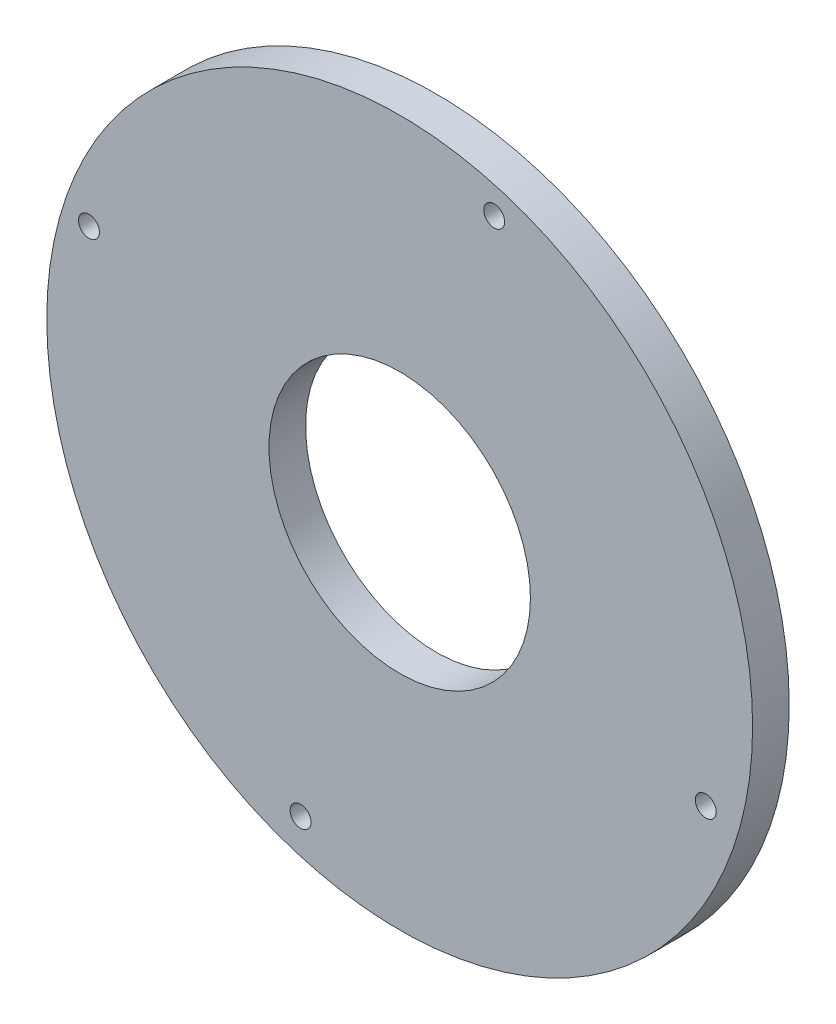
ISO-10303-21;
HEADER;
FILE_DESCRIPTION(('STEP AP214'),'2;1');
FILE_NAME('part.step','',(''),(''),'','','');
FILE_SCHEMA(('AUTOMOTIVE_DESIGN { 1 0 10303 214 1 1 1 1 }'));
ENDSEC;
DATA;
#1=APPLICATION_CONTEXT('core data for automotive mechanical design processes');
#2=APPLICATION_PROTOCOL_DEFINITION('international standard','automotive_design',2000,#1);
#3=PRODUCT_CONTEXT('',#1,'mechanical');
#4=PRODUCT('Part','Part','',(#3));
#5=PRODUCT_RELATED_PRODUCT_CATEGORY('part','',(#4));
#6=PRODUCT_DEFINITION_FORMATION('','',#4);
#7=PRODUCT_DEFINITION_CONTEXT('part definition',#1,'design');
#8=PRODUCT_DEFINITION('design','',#6,#7);
#9=PRODUCT_DEFINITION_SHAPE('','',#8);
#10=(LENGTH_UNIT() NAMED_UNIT(*) SI_UNIT(.MILLI.,.METRE.));
#11=(NAMED_UNIT(*) PLANE_ANGLE_UNIT() SI_UNIT($,.RADIAN.));
#12=(NAMED_UNIT(*) SI_UNIT($,.STERADIAN.) SOLID_ANGLE_UNIT());
#13=UNCERTAINTY_MEASURE_WITH_UNIT(LENGTH_MEASURE(1.E-05),#10,'distance_accuracy_value','');
#14=(GEOMETRIC_REPRESENTATION_CONTEXT(3) GLOBAL_UNCERTAINTY_ASSIGNED_CONTEXT((#13)) GLOBAL_UNIT_ASSIGNED_CONTEXT((#10,
#11,#12)) REPRESENTATION_CONTEXT('',''));
#15=CARTESIAN_POINT('',(0.,0.,0.));
#16=DIRECTION('',(0.,0.,1.));
#17=DIRECTION('',(1.,0.,0.));
#18=AXIS2_PLACEMENT_3D('',#15,#16,#17);
#19=CARTESIAN_POINT('',(0.,0.,7.));
#20=DIRECTION('',(0.,0.,-1.));
#21=DIRECTION('',(-1.,0.,0.));
#22=AXIS2_PLACEMENT_3D('',#19,#20,#21);
#23=CYLINDRICAL_SURFACE('',#22,135.);
#24=CARTESIAN_POINT('',(0.,0.,7.));
#25=DIRECTION('',(0.,0.,1.));
#26=DIRECTION('',(1.,0.,0.));
#27=AXIS2_PLACEMENT_3D('',#24,#25,#26);
#28=CIRCLE('',#27,135.);
#29=CARTESIAN_POINT('',(135.,0.,7.));
#30=VERTEX_POINT('',#29);
#31=EDGE_CURVE('E10',#30,#30,#28,.T.);
#32=ORIENTED_EDGE('',*,*,#31,.F.);
#33=EDGE_LOOP('',(#32));
#34=FACE_BOUND('',#33,.T.);
#35=CARTESIAN_POINT('',(0.,0.,-7.));
#36=DIRECTION('',(0.,0.,1.));
#37=DIRECTION('',(1.,0.,0.));
#38=AXIS2_PLACEMENT_3D('',#35,#36,#37);
#39=CIRCLE('',#38,135.);
#40=CARTESIAN_POINT('',(135.,0.,-7.));
#41=VERTEX_POINT('',#40);
#42=EDGE_CURVE('E36',#41,#41,#39,.T.);
#43=ORIENTED_EDGE('',*,*,#42,.T.);
#44=EDGE_LOOP('',(#43));
#45=FACE_BOUND('',#44,.T.);
#46=ADVANCED_FACE('F33',(#34,#45),#23,.T.);
#47=CARTESIAN_POINT('',(0.,0.,7.));
#48=DIRECTION('',(0.,0.,1.));
#49=DIRECTION('',(1.,0.,0.));
#50=AXIS2_PLACEMENT_3D('',#47,#48,#49);
#51=PLANE('',#50);
#52=CARTESIAN_POINT('',(-37.9203387518934,-116.260536074605,7.));
#53=DIRECTION('',(0.,0.,1.));
#54=DIRECTION('',(1.,0.,0.));
#55=AXIS2_PLACEMENT_3D('',#52,#53,#54);
#56=CIRCLE('',#55,4.00000000000001);
#57=CARTESIAN_POINT('',(-33.9203387518934,-116.260536074605,7.));
#58=VERTEX_POINT('',#57);
#59=EDGE_CURVE('E69',#58,#58,#56,.T.);
#60=ORIENTED_EDGE('',*,*,#59,.F.);
#61=EDGE_LOOP('',(#60));
#62=FACE_BOUND('',#61,.T.);
#63=CARTESIAN_POINT('',(117.072774641553,-35.3331257765481,7.));
#64=DIRECTION('',(0.,0.,1.));
#65=DIRECTION('',(1.,0.,0.));
#66=AXIS2_PLACEMENT_3D('',#63,#64,#65);
#67=CIRCLE('',#66,4.00000000000001);
#68=CARTESIAN_POINT('',(121.072774641553,-35.3331257765481,7.));
#69=VERTEX_POINT('',#68);
#70=EDGE_CURVE('E63',#69,#69,#67,.T.);
#71=ORIENTED_EDGE('',*,*,#70,.F.);
#72=EDGE_LOOP('',(#71));
#73=FACE_BOUND('',#72,.T.);
#74=CARTESIAN_POINT('',(36.1453643434964,119.659987616899,7.));
#75=DIRECTION('',(0.,0.,1.));
#76=DIRECTION('',(1.,0.,0.));
#77=AXIS2_PLACEMENT_3D('',#74,#75,#76);
#78=CIRCLE('',#77,4.00000000000001);
#79=CARTESIAN_POINT('',(40.1453643434964,119.659987616899,7.));
#80=VERTEX_POINT('',#79);
#81=EDGE_CURVE('E57',#80,#80,#78,.T.);
#82=ORIENTED_EDGE('',*,*,#81,.F.);
#83=EDGE_LOOP('',(#82));
#84=FACE_BOUND('',#83,.T.);
#85=CARTESIAN_POINT('',(-118.84774904995,38.7325773188418,7.));
#86=DIRECTION('',(0.,0.,1.));
#87=DIRECTION('',(1.,0.,0.));
#88=AXIS2_PLACEMENT_3D('',#85,#86,#87);
#89=CIRCLE('',#88,4.00000000000001);
#90=CARTESIAN_POINT('',(-114.84774904995,38.7325773188418,7.));
#91=VERTEX_POINT('',#90);
#92=EDGE_CURVE('E51',#91,#91,#89,.T.);
#93=ORIENTED_EDGE('',*,*,#92,.F.);
#94=EDGE_LOOP('',(#93));
#95=FACE_BOUND('',#94,.T.);
#96=CARTESIAN_POINT('',(0.,0.,7.));
#97=DIRECTION('',(0.,0.,1.));
#98=DIRECTION('',(1.,0.,0.));
#99=AXIS2_PLACEMENT_3D('',#96,#97,#98);
#100=CIRCLE('',#99,50.);
#101=CARTESIAN_POINT('',(50.,0.,7.));
#102=VERTEX_POINT('',#101);
#103=EDGE_CURVE('E45',#102,#102,#100,.T.);
#104=ORIENTED_EDGE('',*,*,#103,.F.);
#105=EDGE_LOOP('',(#104));
#106=FACE_BOUND('',#105,.T.);
#107=ORIENTED_EDGE('',*,*,#31,.T.);
#108=EDGE_LOOP('',(#107));
#109=FACE_BOUND('',#108,.T.);
#110=ADVANCED_FACE('F85',(#62,#73,#84,#95,#106,#109),#51,.T.);
#111=CARTESIAN_POINT('',(0.,0.,-7.));
#112=DIRECTION('',(0.,0.,1.));
#113=DIRECTION('',(1.,0.,0.));
#114=AXIS2_PLACEMENT_3D('',#111,#112,#113);
#115=PLANE('',#114);
#116=CARTESIAN_POINT('',(-37.9203387518934,-116.260536074605,-7.));
#117=DIRECTION('',(0.,0.,1.));
#118=DIRECTION('',(1.,0.,0.));
#119=AXIS2_PLACEMENT_3D('',#116,#117,#118);
#120=CIRCLE('',#119,4.00000000000001);
#121=CARTESIAN_POINT('',(-33.9203387518934,-116.260536074605,-7.));
#122=VERTEX_POINT('',#121);
#123=EDGE_CURVE('E66',#122,#122,#120,.T.);
#124=ORIENTED_EDGE('',*,*,#123,.T.);
#125=EDGE_LOOP('',(#124));
#126=FACE_BOUND('',#125,.T.);
#127=CARTESIAN_POINT('',(117.072774641553,-35.3331257765481,-7.));
#128=DIRECTION('',(0.,0.,1.));
#129=DIRECTION('',(1.,0.,0.));
#130=AXIS2_PLACEMENT_3D('',#127,#128,#129);
#131=CIRCLE('',#130,4.00000000000001);
#132=CARTESIAN_POINT('',(121.072774641553,-35.3331257765481,-7.));
#133=VERTEX_POINT('',#132);
#134=EDGE_CURVE('E60',#133,#133,#131,.T.);
#135=ORIENTED_EDGE('',*,*,#134,.T.);
#136=EDGE_LOOP('',(#135));
#137=FACE_BOUND('',#136,.T.);
#138=CARTESIAN_POINT('',(36.1453643434964,119.659987616899,-7.));
#139=DIRECTION('',(0.,0.,1.));
#140=DIRECTION('',(1.,0.,0.));
#141=AXIS2_PLACEMENT_3D('',#138,#139,#140);
#142=CIRCLE('',#141,4.00000000000001);
#143=CARTESIAN_POINT('',(40.1453643434964,119.659987616899,-7.));
#144=VERTEX_POINT('',#143);
#145=EDGE_CURVE('E54',#144,#144,#142,.T.);
#146=ORIENTED_EDGE('',*,*,#145,.T.);
#147=EDGE_LOOP('',(#146));
#148=FACE_BOUND('',#147,.T.);
#149=CARTESIAN_POINT('',(-118.84774904995,38.7325773188418,-7.));
#150=DIRECTION('',(0.,0.,1.));
#151=DIRECTION('',(1.,0.,0.));
#152=AXIS2_PLACEMENT_3D('',#149,#150,#151);
#153=CIRCLE('',#152,4.00000000000001);
#154=CARTESIAN_POINT('',(-114.84774904995,38.7325773188418,-7.));
#155=VERTEX_POINT('',#154);
#156=EDGE_CURVE('E48',#155,#155,#153,.T.);
#157=ORIENTED_EDGE('',*,*,#156,.T.);
#158=EDGE_LOOP('',(#157));
#159=FACE_BOUND('',#158,.T.);
#160=CARTESIAN_POINT('',(0.,0.,-7.));
#161=DIRECTION('',(0.,0.,1.));
#162=DIRECTION('',(1.,0.,0.));
#163=AXIS2_PLACEMENT_3D('',#160,#161,#162);
#164=CIRCLE('',#163,50.);
#165=CARTESIAN_POINT('',(50.,0.,-7.));
#166=VERTEX_POINT('',#165);
#167=EDGE_CURVE('E43',#166,#166,#164,.T.);
#168=ORIENTED_EDGE('',*,*,#167,.T.);
#169=EDGE_LOOP('',(#168));
#170=FACE_BOUND('',#169,.T.);
#171=ORIENTED_EDGE('',*,*,#42,.F.);
#172=EDGE_LOOP('',(#171));
#173=FACE_BOUND('',#172,.T.);
#174=ADVANCED_FACE('F75',(#126,#137,#148,#159,#170,#173),#115,.F.);
#175=CARTESIAN_POINT('',(0.,0.,-7.));
#176=DIRECTION('',(0.,0.,1.));
#177=DIRECTION('',(1.,0.,0.));
#178=AXIS2_PLACEMENT_3D('',#175,#176,#177);
#179=CYLINDRICAL_SURFACE('',#178,50.);
#180=ORIENTED_EDGE('',*,*,#167,.F.);
#181=EDGE_LOOP('',(#180));
#182=FACE_BOUND('',#181,.T.);
#183=ORIENTED_EDGE('',*,*,#103,.T.);
#184=EDGE_LOOP('',(#183));
#185=FACE_BOUND('',#184,.T.);
#186=ADVANCED_FACE('F97',(#182,#185),#179,.F.);
#187=CARTESIAN_POINT('',(-118.84774904995,38.7325773188418,-7.));
#188=DIRECTION('',(0.,0.,1.));
#189=DIRECTION('',(1.,0.,0.));
#190=AXIS2_PLACEMENT_3D('',#187,#188,#189);
#191=CYLINDRICAL_SURFACE('',#190,4.00000000000001);
#192=ORIENTED_EDGE('',*,*,#156,.F.);
#193=EDGE_LOOP('',(#192));
#194=FACE_BOUND('',#193,.T.);
#195=ORIENTED_EDGE('',*,*,#92,.T.);
#196=EDGE_LOOP('',(#195));
#197=FACE_BOUND('',#196,.T.);
#198=ADVANCED_FACE('F99',(#194,#197),#191,.F.);
#199=CARTESIAN_POINT('',(36.1453643434964,119.659987616899,-7.));
#200=DIRECTION('',(0.,0.,1.));
#201=DIRECTION('',(1.,0.,0.));
#202=AXIS2_PLACEMENT_3D('',#199,#200,#201);
#203=CYLINDRICAL_SURFACE('',#202,4.00000000000001);
#204=ORIENTED_EDGE('',*,*,#145,.F.);
#205=EDGE_LOOP('',(#204));
#206=FACE_BOUND('',#205,.T.);
#207=ORIENTED_EDGE('',*,*,#81,.T.);
#208=EDGE_LOOP('',(#207));
#209=FACE_BOUND('',#208,.T.);
#210=ADVANCED_FACE('F106',(#206,#209),#203,.F.);
#211=CARTESIAN_POINT('',(117.072774641553,-35.3331257765481,-7.));
#212=DIRECTION('',(0.,0.,1.));
#213=DIRECTION('',(1.,0.,0.));
#214=AXIS2_PLACEMENT_3D('',#211,#212,#213);
#215=CYLINDRICAL_SURFACE('',#214,4.00000000000001);
#216=ORIENTED_EDGE('',*,*,#134,.F.);
#217=EDGE_LOOP('',(#216));
#218=FACE_BOUND('',#217,.T.);
#219=ORIENTED_EDGE('',*,*,#70,.T.);
#220=EDGE_LOOP('',(#219));
#221=FACE_BOUND('',#220,.T.);
#222=ADVANCED_FACE('F81',(#218,#221),#215,.F.);
#223=CARTESIAN_POINT('',(-37.9203387518934,-116.260536074605,-7.));
#224=DIRECTION('',(0.,0.,1.));
#225=DIRECTION('',(1.,0.,0.));
#226=AXIS2_PLACEMENT_3D('',#223,#224,#225);
#227=CYLINDRICAL_SURFACE('',#226,4.00000000000001);
#228=ORIENTED_EDGE('',*,*,#123,.F.);
#229=EDGE_LOOP('',(#228));
#230=FACE_BOUND('',#229,.T.);
#231=ORIENTED_EDGE('',*,*,#59,.T.);
#232=EDGE_LOOP('',(#231));
#233=FACE_BOUND('',#232,.T.);
#234=ADVANCED_FACE('F78',(#230,#233),#227,.F.);
#235=CLOSED_SHELL('',(#46,#110,#174,#186,#198,#210,#222,#234));
#236=MANIFOLD_SOLID_BREP('B2',#235);
#237=ADVANCED_BREP_SHAPE_REPRESENTATION('',(#18,#236),#14);
#238=SHAPE_DEFINITION_REPRESENTATION(#9,#237);
ENDSEC;
END-ISO-10303-21;
